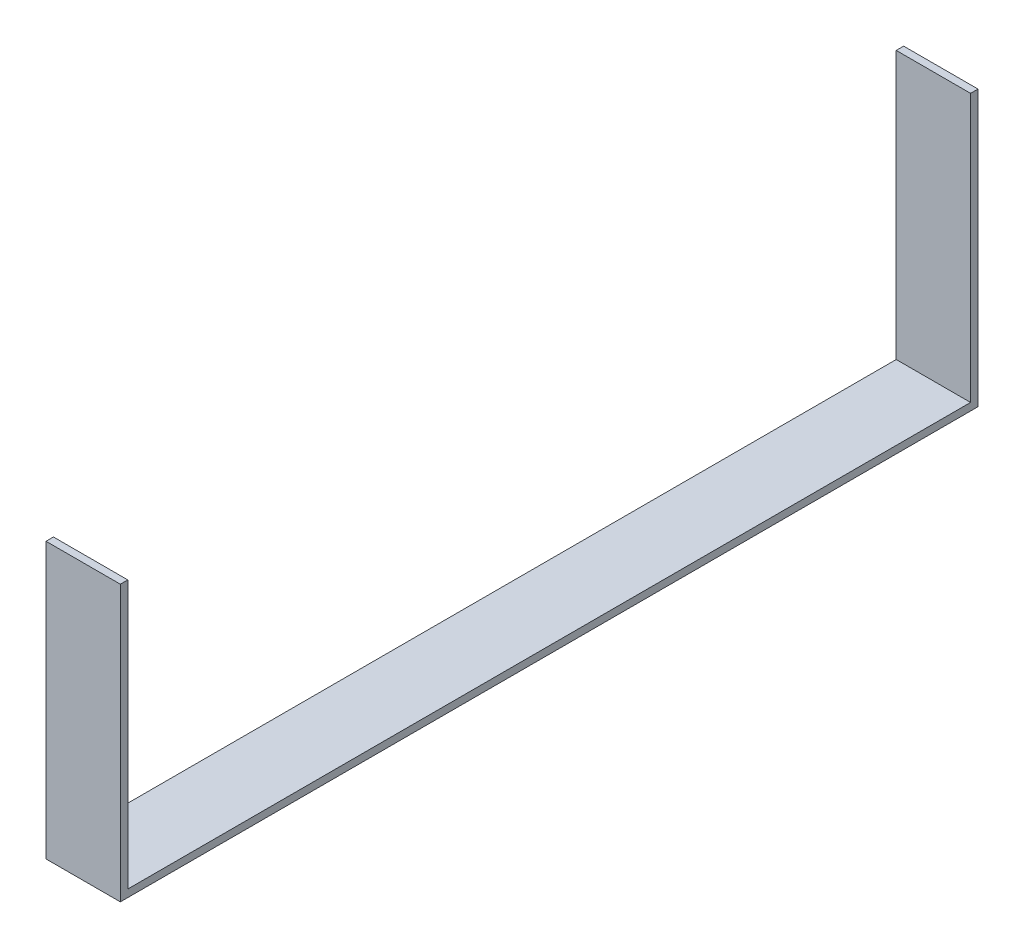
ISO-10303-21;
HEADER;
FILE_DESCRIPTION(('STEP AP214'),'2;1');
FILE_NAME('part.step','',(''),(''),'','','');
FILE_SCHEMA(('AUTOMOTIVE_DESIGN { 1 0 10303 214 1 1 1 1 }'));
ENDSEC;
DATA;
#1=APPLICATION_CONTEXT('core data for automotive mechanical design processes');
#2=APPLICATION_PROTOCOL_DEFINITION('international standard','automotive_design',2000,#1);
#3=PRODUCT_CONTEXT('',#1,'mechanical');
#4=PRODUCT('Part','Part','',(#3));
#5=PRODUCT_RELATED_PRODUCT_CATEGORY('part','',(#4));
#6=PRODUCT_DEFINITION_FORMATION('','',#4);
#7=PRODUCT_DEFINITION_CONTEXT('part definition',#1,'design');
#8=PRODUCT_DEFINITION('design','',#6,#7);
#9=PRODUCT_DEFINITION_SHAPE('','',#8);
#10=(LENGTH_UNIT() NAMED_UNIT(*) SI_UNIT(.MILLI.,.METRE.));
#11=(NAMED_UNIT(*) PLANE_ANGLE_UNIT() SI_UNIT($,.RADIAN.));
#12=(NAMED_UNIT(*) SI_UNIT($,.STERADIAN.) SOLID_ANGLE_UNIT());
#13=UNCERTAINTY_MEASURE_WITH_UNIT(LENGTH_MEASURE(1.E-05),#10,'distance_accuracy_value','');
#14=(GEOMETRIC_REPRESENTATION_CONTEXT(3) GLOBAL_UNCERTAINTY_ASSIGNED_CONTEXT((#13)) GLOBAL_UNIT_ASSIGNED_CONTEXT((#10,
#11,#12)) REPRESENTATION_CONTEXT('',''));
#15=CARTESIAN_POINT('',(0.,0.,0.));
#16=DIRECTION('',(0.,0.,1.));
#17=DIRECTION('',(1.,0.,0.));
#18=AXIS2_PLACEMENT_3D('',#15,#16,#17);
#19=CARTESIAN_POINT('',(15.,54.,85.));
#20=DIRECTION('',(0.,-1.,0.));
#21=DIRECTION('',(0.,0.,-1.));
#22=AXIS2_PLACEMENT_3D('',#19,#20,#21);
#23=PLANE('',#22);
#24=DIRECTION('',(0.,0.,1.));
#25=VECTOR('',#24,1.);
#26=CARTESIAN_POINT('',(0.,54.,85.));
#27=LINE('',#26,#25);
#28=CARTESIAN_POINT('',(0.,54.,85.));
#29=VERTEX_POINT('',#28);
#30=CARTESIAN_POINT('',(0.,54.,86.5));
#31=VERTEX_POINT('',#30);
#32=EDGE_CURVE('E129',#29,#31,#27,.T.);
#33=ORIENTED_EDGE('',*,*,#32,.T.);
#34=DIRECTION('',(-1.,0.,0.));
#35=VECTOR('',#34,1.);
#36=CARTESIAN_POINT('',(15.,54.,86.5));
#37=LINE('',#36,#35);
#38=CARTESIAN_POINT('',(15.,54.,86.5));
#39=VERTEX_POINT('',#38);
#40=EDGE_CURVE('E11',#39,#31,#37,.T.);
#41=ORIENTED_EDGE('',*,*,#40,.F.);
#42=DIRECTION('',(0.,0.,1.));
#43=VECTOR('',#42,1.);
#44=CARTESIAN_POINT('',(15.,54.,85.));
#45=LINE('',#44,#43);
#46=CARTESIAN_POINT('',(15.,54.,85.));
#47=VERTEX_POINT('',#46);
#48=EDGE_CURVE('E143',#47,#39,#45,.T.);
#49=ORIENTED_EDGE('',*,*,#48,.F.);
#50=DIRECTION('',(-1.,0.,0.));
#51=VECTOR('',#50,1.);
#52=CARTESIAN_POINT('',(15.,54.,85.));
#53=LINE('',#52,#51);
#54=EDGE_CURVE('E125',#47,#29,#53,.T.);
#55=ORIENTED_EDGE('',*,*,#54,.T.);
#56=EDGE_LOOP('',(#33,#41,#49,#55));
#57=FACE_BOUND('',#56,.T.);
#58=ADVANCED_FACE('F33',(#57),#23,.F.);
#59=CARTESIAN_POINT('',(15.,54.,86.5));
#60=DIRECTION('',(0.,0.,-1.));
#61=DIRECTION('',(0.,1.,0.));
#62=AXIS2_PLACEMENT_3D('',#59,#60,#61);
#63=PLANE('',#62);
#64=DIRECTION('',(0.,-1.,0.));
#65=VECTOR('',#64,1.);
#66=CARTESIAN_POINT('',(0.,54.,86.5));
#67=LINE('',#66,#65);
#68=CARTESIAN_POINT('',(0.,-1.5,86.5));
#69=VERTEX_POINT('',#68);
#70=EDGE_CURVE('E132',#31,#69,#67,.T.);
#71=ORIENTED_EDGE('',*,*,#70,.T.);
#72=DIRECTION('',(-1.,0.,0.));
#73=VECTOR('',#72,1.);
#74=CARTESIAN_POINT('',(15.,-1.5,86.5));
#75=LINE('',#74,#73);
#76=CARTESIAN_POINT('',(15.,-1.5,86.5));
#77=VERTEX_POINT('',#76);
#78=EDGE_CURVE('E41',#77,#69,#75,.T.);
#79=ORIENTED_EDGE('',*,*,#78,.F.);
#80=DIRECTION('',(0.,-1.,0.));
#81=VECTOR('',#80,1.);
#82=CARTESIAN_POINT('',(15.,54.,86.5));
#83=LINE('',#82,#81);
#84=EDGE_CURVE('E92',#39,#77,#83,.T.);
#85=ORIENTED_EDGE('',*,*,#84,.F.);
#86=ORIENTED_EDGE('',*,*,#40,.T.);
#87=EDGE_LOOP('',(#71,#79,#85,#86));
#88=FACE_BOUND('',#87,.T.);
#89=ADVANCED_FACE('F178',(#88),#63,.F.);
#90=CARTESIAN_POINT('',(15.,-1.5,86.5));
#91=DIRECTION('',(0.,1.,0.));
#92=DIRECTION('',(0.,0.,1.));
#93=AXIS2_PLACEMENT_3D('',#90,#91,#92);
#94=PLANE('',#93);
#95=DIRECTION('',(0.,0.,-1.));
#96=VECTOR('',#95,1.);
#97=CARTESIAN_POINT('',(0.,-1.5,86.5));
#98=LINE('',#97,#96);
#99=CARTESIAN_POINT('',(0.,-1.5,-86.5));
#100=VERTEX_POINT('',#99);
#101=EDGE_CURVE('E134',#69,#100,#98,.T.);
#102=ORIENTED_EDGE('',*,*,#101,.T.);
#103=DIRECTION('',(-1.,0.,0.));
#104=VECTOR('',#103,1.);
#105=CARTESIAN_POINT('',(15.,-1.5,-86.5));
#106=LINE('',#105,#104);
#107=CARTESIAN_POINT('',(15.,-1.5,-86.5));
#108=VERTEX_POINT('',#107);
#109=EDGE_CURVE('E150',#108,#100,#106,.T.);
#110=ORIENTED_EDGE('',*,*,#109,.F.);
#111=DIRECTION('',(0.,0.,-1.));
#112=VECTOR('',#111,1.);
#113=CARTESIAN_POINT('',(15.,-1.5,86.5));
#114=LINE('',#113,#112);
#115=EDGE_CURVE('E158',#77,#108,#114,.T.);
#116=ORIENTED_EDGE('',*,*,#115,.F.);
#117=ORIENTED_EDGE('',*,*,#78,.T.);
#118=EDGE_LOOP('',(#102,#110,#116,#117));
#119=FACE_BOUND('',#118,.T.);
#120=ADVANCED_FACE('F156',(#119),#94,.F.);
#121=CARTESIAN_POINT('',(15.,-1.5,-86.5));
#122=DIRECTION('',(0.,0.,1.));
#123=DIRECTION('',(1.,0.,0.));
#124=AXIS2_PLACEMENT_3D('',#121,#122,#123);
#125=PLANE('',#124);
#126=DIRECTION('',(0.,1.,0.));
#127=VECTOR('',#126,1.);
#128=CARTESIAN_POINT('',(0.,-1.5,-86.5));
#129=LINE('',#128,#127);
#130=CARTESIAN_POINT('',(0.,54.,-86.5));
#131=VERTEX_POINT('',#130);
#132=EDGE_CURVE('E136',#100,#131,#129,.T.);
#133=ORIENTED_EDGE('',*,*,#132,.T.);
#134=DIRECTION('',(-1.,0.,0.));
#135=VECTOR('',#134,1.);
#136=CARTESIAN_POINT('',(15.,54.,-86.5));
#137=LINE('',#136,#135);
#138=CARTESIAN_POINT('',(15.,54.,-86.5));
#139=VERTEX_POINT('',#138);
#140=EDGE_CURVE('E147',#139,#131,#137,.T.);
#141=ORIENTED_EDGE('',*,*,#140,.F.);
#142=DIRECTION('',(0.,1.,0.));
#143=VECTOR('',#142,1.);
#144=CARTESIAN_POINT('',(15.,-1.5,-86.5));
#145=LINE('',#144,#143);
#146=EDGE_CURVE('E170',#108,#139,#145,.T.);
#147=ORIENTED_EDGE('',*,*,#146,.F.);
#148=ORIENTED_EDGE('',*,*,#109,.T.);
#149=EDGE_LOOP('',(#133,#141,#147,#148));
#150=FACE_BOUND('',#149,.T.);
#151=ADVANCED_FACE('F166',(#150),#125,.F.);
#152=CARTESIAN_POINT('',(15.,54.,-85.));
#153=DIRECTION('',(0.,-1.,0.));
#154=DIRECTION('',(0.,0.,-1.));
#155=AXIS2_PLACEMENT_3D('',#152,#153,#154);
#156=PLANE('',#155);
#157=DIRECTION('',(0.,0.,1.));
#158=VECTOR('',#157,1.);
#159=CARTESIAN_POINT('',(0.,54.,-85.));
#160=LINE('',#159,#158);
#161=CARTESIAN_POINT('',(0.,54.,-85.));
#162=VERTEX_POINT('',#161);
#163=EDGE_CURVE('E138',#131,#162,#160,.T.);
#164=ORIENTED_EDGE('',*,*,#163,.T.);
#165=DIRECTION('',(-1.,0.,0.));
#166=VECTOR('',#165,1.);
#167=CARTESIAN_POINT('',(15.,54.,-85.));
#168=LINE('',#167,#166);
#169=CARTESIAN_POINT('',(15.,54.,-85.));
#170=VERTEX_POINT('',#169);
#171=EDGE_CURVE('E120',#170,#162,#168,.T.);
#172=ORIENTED_EDGE('',*,*,#171,.F.);
#173=DIRECTION('',(0.,0.,1.));
#174=VECTOR('',#173,1.);
#175=CARTESIAN_POINT('',(15.,54.,-85.));
#176=LINE('',#175,#174);
#177=EDGE_CURVE('E111',#139,#170,#176,.T.);
#178=ORIENTED_EDGE('',*,*,#177,.F.);
#179=ORIENTED_EDGE('',*,*,#140,.T.);
#180=EDGE_LOOP('',(#164,#172,#178,#179));
#181=FACE_BOUND('',#180,.T.);
#182=ADVANCED_FACE('F169',(#181),#156,.F.);
#183=CARTESIAN_POINT('',(15.,0.,-85.));
#184=DIRECTION('',(0.,0.,-1.));
#185=DIRECTION('',(-1.,0.,0.));
#186=AXIS2_PLACEMENT_3D('',#183,#184,#185);
#187=PLANE('',#186);
#188=DIRECTION('',(0.,-1.,0.));
#189=VECTOR('',#188,1.);
#190=CARTESIAN_POINT('',(0.,0.,-85.));
#191=LINE('',#190,#189);
#192=CARTESIAN_POINT('',(0.,0.,-85.));
#193=VERTEX_POINT('',#192);
#194=EDGE_CURVE('E119',#162,#193,#191,.T.);
#195=ORIENTED_EDGE('',*,*,#194,.T.);
#196=DIRECTION('',(-1.,0.,0.));
#197=VECTOR('',#196,1.);
#198=CARTESIAN_POINT('',(15.,0.,-85.));
#199=LINE('',#198,#197);
#200=CARTESIAN_POINT('',(15.,0.,-85.));
#201=VERTEX_POINT('',#200);
#202=EDGE_CURVE('E116',#201,#193,#199,.T.);
#203=ORIENTED_EDGE('',*,*,#202,.F.);
#204=DIRECTION('',(0.,-1.,0.));
#205=VECTOR('',#204,1.);
#206=CARTESIAN_POINT('',(15.,0.,-85.));
#207=LINE('',#206,#205);
#208=EDGE_CURVE('E105',#170,#201,#207,.T.);
#209=ORIENTED_EDGE('',*,*,#208,.F.);
#210=ORIENTED_EDGE('',*,*,#171,.T.);
#211=EDGE_LOOP('',(#195,#203,#209,#210));
#212=FACE_BOUND('',#211,.T.);
#213=ADVANCED_FACE('F117',(#212),#187,.F.);
#214=CARTESIAN_POINT('',(15.,0.,85.));
#215=DIRECTION('',(0.,-1.,0.));
#216=DIRECTION('',(0.,0.,-1.));
#217=AXIS2_PLACEMENT_3D('',#214,#215,#216);
#218=PLANE('',#217);
#219=DIRECTION('',(0.,0.,1.));
#220=VECTOR('',#219,1.);
#221=CARTESIAN_POINT('',(0.,0.,85.));
#222=LINE('',#221,#220);
#223=CARTESIAN_POINT('',(0.,0.,85.));
#224=VERTEX_POINT('',#223);
#225=EDGE_CURVE('E78',#193,#224,#222,.T.);
#226=ORIENTED_EDGE('',*,*,#225,.T.);
#227=DIRECTION('',(-1.,0.,0.));
#228=VECTOR('',#227,1.);
#229=CARTESIAN_POINT('',(15.,0.,85.));
#230=LINE('',#229,#228);
#231=CARTESIAN_POINT('',(15.,0.,85.));
#232=VERTEX_POINT('',#231);
#233=EDGE_CURVE('E121',#232,#224,#230,.T.);
#234=ORIENTED_EDGE('',*,*,#233,.F.);
#235=DIRECTION('',(0.,0.,1.));
#236=VECTOR('',#235,1.);
#237=CARTESIAN_POINT('',(15.,0.,85.));
#238=LINE('',#237,#236);
#239=EDGE_CURVE('E109',#201,#232,#238,.T.);
#240=ORIENTED_EDGE('',*,*,#239,.F.);
#241=ORIENTED_EDGE('',*,*,#202,.T.);
#242=EDGE_LOOP('',(#226,#234,#240,#241));
#243=FACE_BOUND('',#242,.T.);
#244=ADVANCED_FACE('F123',(#243),#218,.F.);
#245=CARTESIAN_POINT('',(15.,54.,85.));
#246=DIRECTION('',(0.,0.,1.));
#247=DIRECTION('',(1.,0.,0.));
#248=AXIS2_PLACEMENT_3D('',#245,#246,#247);
#249=PLANE('',#248);
#250=DIRECTION('',(0.,1.,0.));
#251=VECTOR('',#250,1.);
#252=CARTESIAN_POINT('',(0.,54.,85.));
#253=LINE('',#252,#251);
#254=EDGE_CURVE('E84',#224,#29,#253,.T.);
#255=ORIENTED_EDGE('',*,*,#254,.T.);
#256=ORIENTED_EDGE('',*,*,#54,.F.);
#257=DIRECTION('',(0.,1.,0.));
#258=VECTOR('',#257,1.);
#259=CARTESIAN_POINT('',(15.,54.,85.));
#260=LINE('',#259,#258);
#261=EDGE_CURVE('E49',#232,#47,#260,.T.);
#262=ORIENTED_EDGE('',*,*,#261,.F.);
#263=ORIENTED_EDGE('',*,*,#233,.T.);
#264=EDGE_LOOP('',(#255,#256,#262,#263));
#265=FACE_BOUND('',#264,.T.);
#266=ADVANCED_FACE('F194',(#265),#249,.F.);
#267=CARTESIAN_POINT('',(15.,0.,0.));
#268=DIRECTION('',(1.,0.,0.));
#269=DIRECTION('',(0.,0.,-1.));
#270=AXIS2_PLACEMENT_3D('',#267,#268,#269);
#271=PLANE('',#270);
#272=ORIENTED_EDGE('',*,*,#48,.T.);
#273=ORIENTED_EDGE('',*,*,#84,.T.);
#274=ORIENTED_EDGE('',*,*,#115,.T.);
#275=ORIENTED_EDGE('',*,*,#146,.T.);
#276=ORIENTED_EDGE('',*,*,#177,.T.);
#277=ORIENTED_EDGE('',*,*,#208,.T.);
#278=ORIENTED_EDGE('',*,*,#239,.T.);
#279=ORIENTED_EDGE('',*,*,#261,.T.);
#280=EDGE_LOOP('',(#272,#273,#274,#275,#276,#277,#278,#279));
#281=FACE_BOUND('',#280,.T.);
#282=ADVANCED_FACE('F107',(#281),#271,.T.);
#283=CARTESIAN_POINT('',(0.,0.,0.));
#284=DIRECTION('',(1.,0.,0.));
#285=DIRECTION('',(0.,0.,-1.));
#286=AXIS2_PLACEMENT_3D('',#283,#284,#285);
#287=PLANE('',#286);
#288=ORIENTED_EDGE('',*,*,#32,.F.);
#289=ORIENTED_EDGE('',*,*,#254,.F.);
#290=ORIENTED_EDGE('',*,*,#225,.F.);
#291=ORIENTED_EDGE('',*,*,#194,.F.);
#292=ORIENTED_EDGE('',*,*,#163,.F.);
#293=ORIENTED_EDGE('',*,*,#132,.F.);
#294=ORIENTED_EDGE('',*,*,#101,.F.);
#295=ORIENTED_EDGE('',*,*,#70,.F.);
#296=EDGE_LOOP('',(#288,#289,#290,#291,#292,#293,#294,#295));
#297=FACE_BOUND('',#296,.T.);
#298=ADVANCED_FACE('F162',(#297),#287,.F.);
#299=CLOSED_SHELL('',(#58,#89,#120,#151,#182,#213,#244,#266,#282,#298));
#300=MANIFOLD_SOLID_BREP('B2',#299);
#301=ADVANCED_BREP_SHAPE_REPRESENTATION('',(#18,#300),#14);
#302=SHAPE_DEFINITION_REPRESENTATION(#9,#301);
ENDSEC;
END-ISO-10303-21;
